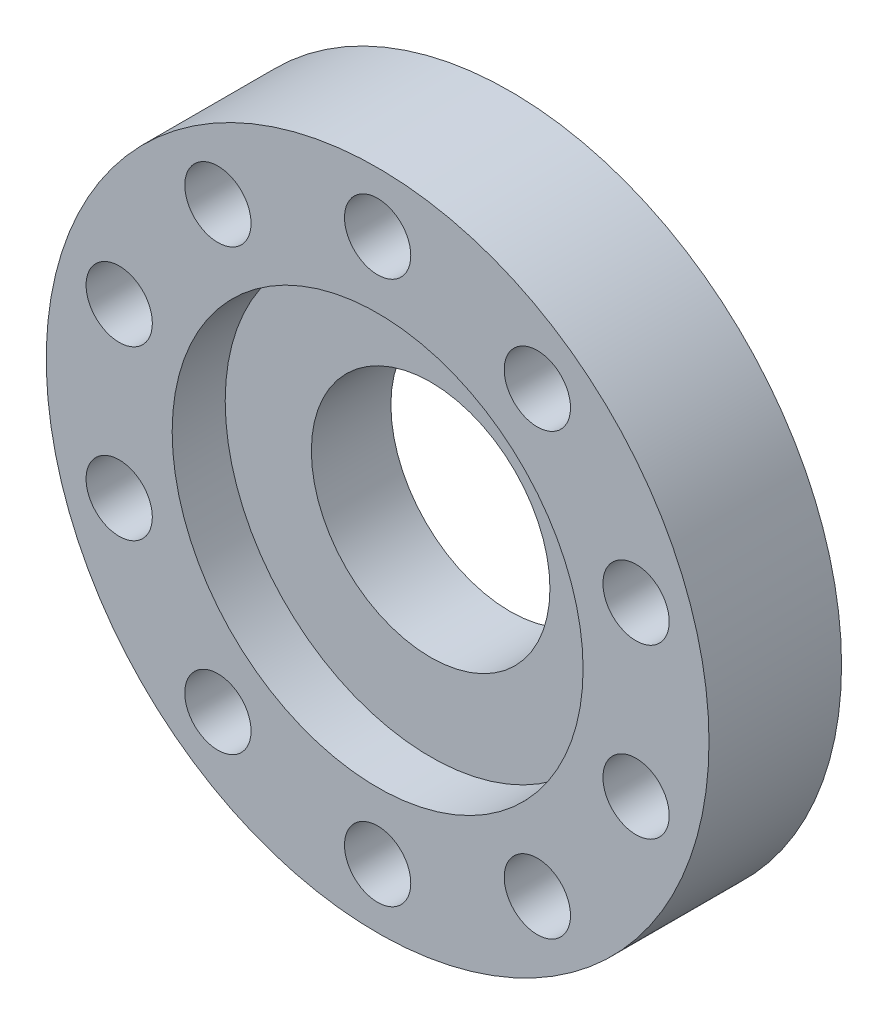
ISO-10303-21;
HEADER;
FILE_DESCRIPTION(('STEP AP214'),'2;1');
FILE_NAME('part.step','',(''),(''),'','','');
FILE_SCHEMA(('AUTOMOTIVE_DESIGN { 1 0 10303 214 1 1 1 1 }'));
ENDSEC;
DATA;
#1=APPLICATION_CONTEXT('core data for automotive mechanical design processes');
#2=APPLICATION_PROTOCOL_DEFINITION('international standard','automotive_design',2000,#1);
#3=PRODUCT_CONTEXT('',#1,'mechanical');
#4=PRODUCT('Part','Part','',(#3));
#5=PRODUCT_RELATED_PRODUCT_CATEGORY('part','',(#4));
#6=PRODUCT_DEFINITION_FORMATION('','',#4);
#7=PRODUCT_DEFINITION_CONTEXT('part definition',#1,'design');
#8=PRODUCT_DEFINITION('design','',#6,#7);
#9=PRODUCT_DEFINITION_SHAPE('','',#8);
#10=(LENGTH_UNIT() NAMED_UNIT(*) SI_UNIT(.MILLI.,.METRE.));
#11=(NAMED_UNIT(*) PLANE_ANGLE_UNIT() SI_UNIT($,.RADIAN.));
#12=(NAMED_UNIT(*) SI_UNIT($,.STERADIAN.) SOLID_ANGLE_UNIT());
#13=UNCERTAINTY_MEASURE_WITH_UNIT(LENGTH_MEASURE(1.E-05),#10,'distance_accuracy_value','');
#14=(GEOMETRIC_REPRESENTATION_CONTEXT(3) GLOBAL_UNCERTAINTY_ASSIGNED_CONTEXT((#13)) GLOBAL_UNIT_ASSIGNED_CONTEXT((#10,
#11,#12)) REPRESENTATION_CONTEXT('',''));
#15=CARTESIAN_POINT('',(0.,0.,0.));
#16=DIRECTION('',(0.,0.,1.));
#17=DIRECTION('',(1.,0.,0.));
#18=AXIS2_PLACEMENT_3D('',#15,#16,#17);
#19=CARTESIAN_POINT('',(0.,0.,20.));
#20=DIRECTION('',(0.,0.,-1.));
#21=DIRECTION('',(-1.,0.,0.));
#22=AXIS2_PLACEMENT_3D('',#19,#20,#21);
#23=CYLINDRICAL_SURFACE('',#22,18.);
#24=CARTESIAN_POINT('',(0.,0.,0.));
#25=DIRECTION('',(0.,0.,1.));
#26=DIRECTION('',(1.,0.,0.));
#27=AXIS2_PLACEMENT_3D('',#24,#25,#26);
#28=CIRCLE('',#27,18.);
#29=CARTESIAN_POINT('',(18.,0.,0.));
#30=VERTEX_POINT('',#29);
#31=EDGE_CURVE('E57',#30,#30,#28,.T.);
#32=ORIENTED_EDGE('',*,*,#31,.F.);
#33=EDGE_LOOP('',(#32));
#34=FACE_BOUND('',#33,.T.);
#35=CARTESIAN_POINT('',(0.,0.,12.));
#36=DIRECTION('',(0.,0.,1.));
#37=DIRECTION('',(1.,0.,0.));
#38=AXIS2_PLACEMENT_3D('',#35,#36,#37);
#39=CIRCLE('',#38,18.);
#40=CARTESIAN_POINT('',(18.,0.,12.));
#41=VERTEX_POINT('',#40);
#42=EDGE_CURVE('E125',#41,#41,#39,.T.);
#43=ORIENTED_EDGE('',*,*,#42,.T.);
#44=EDGE_LOOP('',(#43));
#45=FACE_BOUND('',#44,.T.);
#46=ADVANCED_FACE('F46',(#34,#45),#23,.F.);
#47=CARTESIAN_POINT('',(0.,0.,20.));
#48=DIRECTION('',(0.,0.,1.));
#49=DIRECTION('',(1.,0.,0.));
#50=AXIS2_PLACEMENT_3D('',#47,#48,#49);
#51=PLANE('',#50);
#52=CARTESIAN_POINT('',(0.,0.,20.));
#53=DIRECTION('',(0.,0.,1.));
#54=DIRECTION('',(1.,0.,0.));
#55=AXIS2_PLACEMENT_3D('',#52,#53,#54);
#56=CIRCLE('',#55,31.);
#57=CARTESIAN_POINT('',(31.,0.,20.));
#58=VERTEX_POINT('',#57);
#59=EDGE_CURVE('E122',#58,#58,#56,.T.);
#60=ORIENTED_EDGE('',*,*,#59,.F.);
#61=EDGE_LOOP('',(#60));
#62=FACE_BOUND('',#61,.T.);
#63=CARTESIAN_POINT('',(38.9933171681012,-12.6696967693733,20.));
#64=DIRECTION('',(0.,0.,1.));
#65=DIRECTION('',(1.,0.,0.));
#66=AXIS2_PLACEMENT_3D('',#63,#64,#65);
#67=CIRCLE('',#66,5.);
#68=CARTESIAN_POINT('',(43.9933171681012,-12.6696967693733,20.));
#69=VERTEX_POINT('',#68);
#70=EDGE_CURVE('E107',#69,#69,#67,.T.);
#71=ORIENTED_EDGE('',*,*,#70,.F.);
#72=EDGE_LOOP('',(#71));
#73=FACE_BOUND('',#72,.T.);
#74=CARTESIAN_POINT('',(24.0991953439917,33.1696967693726,20.));
#75=DIRECTION('',(0.,0.,1.));
#76=DIRECTION('',(1.,0.,0.));
#77=AXIS2_PLACEMENT_3D('',#74,#75,#76);
#78=CIRCLE('',#77,5.);
#79=CARTESIAN_POINT('',(29.0991953439917,33.1696967693726,20.));
#80=VERTEX_POINT('',#79);
#81=EDGE_CURVE('E95',#80,#80,#78,.T.);
#82=ORIENTED_EDGE('',*,*,#81,.F.);
#83=EDGE_LOOP('',(#82));
#84=FACE_BOUND('',#83,.T.);
#85=CARTESIAN_POINT('',(-24.0991953439912,33.169696769373,20.));
#86=DIRECTION('',(0.,0.,1.));
#87=DIRECTION('',(1.,0.,0.));
#88=AXIS2_PLACEMENT_3D('',#85,#86,#87);
#89=CIRCLE('',#88,5.);
#90=CARTESIAN_POINT('',(-19.0991953439912,33.169696769373,20.));
#91=VERTEX_POINT('',#90);
#92=EDGE_CURVE('E83',#91,#91,#89,.T.);
#93=ORIENTED_EDGE('',*,*,#92,.F.);
#94=EDGE_LOOP('',(#93));
#95=FACE_BOUND('',#94,.T.);
#96=CARTESIAN_POINT('',(-38.9933171681013,-12.6696967693727,20.));
#97=DIRECTION('',(0.,0.,1.));
#98=DIRECTION('',(1.,0.,0.));
#99=AXIS2_PLACEMENT_3D('',#96,#97,#98);
#100=CIRCLE('',#99,5.);
#101=CARTESIAN_POINT('',(-33.9933171681013,-12.6696967693727,20.));
#102=VERTEX_POINT('',#101);
#103=EDGE_CURVE('E71',#102,#102,#100,.T.);
#104=ORIENTED_EDGE('',*,*,#103,.F.);
#105=EDGE_LOOP('',(#104));
#106=FACE_BOUND('',#105,.T.);
#107=CARTESIAN_POINT('',(0.,-41.,20.));
#108=DIRECTION('',(0.,0.,1.));
#109=DIRECTION('',(1.,0.,0.));
#110=AXIS2_PLACEMENT_3D('',#107,#108,#109);
#111=CIRCLE('',#110,5.);
#112=CARTESIAN_POINT('',(5.,-41.,20.));
#113=VERTEX_POINT('',#112);
#114=EDGE_CURVE('E61',#113,#113,#111,.T.);
#115=ORIENTED_EDGE('',*,*,#114,.F.);
#116=EDGE_LOOP('',(#115));
#117=FACE_BOUND('',#116,.T.);
#118=CARTESIAN_POINT('',(0.,0.,20.));
#119=DIRECTION('',(0.,0.,1.));
#120=DIRECTION('',(1.,0.,0.));
#121=AXIS2_PLACEMENT_3D('',#118,#119,#120);
#122=CIRCLE('',#121,50.);
#123=CARTESIAN_POINT('',(50.,0.,20.));
#124=VERTEX_POINT('',#123);
#125=EDGE_CURVE('E12',#124,#124,#122,.T.);
#126=ORIENTED_EDGE('',*,*,#125,.T.);
#127=EDGE_LOOP('',(#126));
#128=FACE_BOUND('',#127,.T.);
#129=CARTESIAN_POINT('',(-24.0991953439915,-33.1696967693728,20.));
#130=DIRECTION('',(0.,0.,1.));
#131=DIRECTION('',(1.,0.,0.));
#132=AXIS2_PLACEMENT_3D('',#129,#130,#131);
#133=CIRCLE('',#132,5.);
#134=CARTESIAN_POINT('',(-19.0991953439915,-33.1696967693728,20.));
#135=VERTEX_POINT('',#134);
#136=EDGE_CURVE('E65',#135,#135,#133,.T.);
#137=ORIENTED_EDGE('',*,*,#136,.F.);
#138=EDGE_LOOP('',(#137));
#139=FACE_BOUND('',#138,.T.);
#140=CARTESIAN_POINT('',(-38.9933171681012,12.669696769373,20.));
#141=DIRECTION('',(0.,0.,1.));
#142=DIRECTION('',(1.,0.,0.));
#143=AXIS2_PLACEMENT_3D('',#140,#141,#142);
#144=CIRCLE('',#143,5.);
#145=CARTESIAN_POINT('',(-33.9933171681012,12.669696769373,20.));
#146=VERTEX_POINT('',#145);
#147=EDGE_CURVE('E77',#146,#146,#144,.T.);
#148=ORIENTED_EDGE('',*,*,#147,.F.);
#149=EDGE_LOOP('',(#148));
#150=FACE_BOUND('',#149,.T.);
#151=CARTESIAN_POINT('',(2.77555756156289E-13,41.,20.));
#152=DIRECTION('',(0.,0.,1.));
#153=DIRECTION('',(1.,0.,0.));
#154=AXIS2_PLACEMENT_3D('',#151,#152,#153);
#155=CIRCLE('',#154,5.);
#156=CARTESIAN_POINT('',(5.00000000000028,41.,20.));
#157=VERTEX_POINT('',#156);
#158=EDGE_CURVE('E89',#157,#157,#155,.T.);
#159=ORIENTED_EDGE('',*,*,#158,.F.);
#160=EDGE_LOOP('',(#159));
#161=FACE_BOUND('',#160,.T.);
#162=CARTESIAN_POINT('',(38.9933171681014,12.6696967693725,20.));
#163=DIRECTION('',(0.,0.,1.));
#164=DIRECTION('',(1.,0.,0.));
#165=AXIS2_PLACEMENT_3D('',#162,#163,#164);
#166=CIRCLE('',#165,5.);
#167=CARTESIAN_POINT('',(43.9933171681015,12.6696967693725,20.));
#168=VERTEX_POINT('',#167);
#169=EDGE_CURVE('E101',#168,#168,#166,.T.);
#170=ORIENTED_EDGE('',*,*,#169,.F.);
#171=EDGE_LOOP('',(#170));
#172=FACE_BOUND('',#171,.T.);
#173=CARTESIAN_POINT('',(24.099195343991,-33.1696967693732,20.));
#174=DIRECTION('',(0.,0.,1.));
#175=DIRECTION('',(1.,0.,0.));
#176=AXIS2_PLACEMENT_3D('',#173,#174,#175);
#177=CIRCLE('',#176,5.);
#178=CARTESIAN_POINT('',(29.099195343991,-33.1696967693732,20.));
#179=VERTEX_POINT('',#178);
#180=EDGE_CURVE('E113',#179,#179,#177,.T.);
#181=ORIENTED_EDGE('',*,*,#180,.F.);
#182=EDGE_LOOP('',(#181));
#183=FACE_BOUND('',#182,.T.);
#184=ADVANCED_FACE('F145',(#62,#73,#84,#95,#106,#117,#128,#139,#150,#161,#172,#183),#51,.T.);
#185=CARTESIAN_POINT('',(0.,0.,0.));
#186=DIRECTION('',(0.,0.,1.));
#187=DIRECTION('',(1.,0.,0.));
#188=AXIS2_PLACEMENT_3D('',#185,#186,#187);
#189=PLANE('',#188);
#190=CARTESIAN_POINT('',(0.,0.,0.));
#191=DIRECTION('',(0.,0.,1.));
#192=DIRECTION('',(1.,0.,0.));
#193=AXIS2_PLACEMENT_3D('',#190,#191,#192);
#194=CIRCLE('',#193,50.);
#195=CARTESIAN_POINT('',(50.,0.,0.));
#196=VERTEX_POINT('',#195);
#197=EDGE_CURVE('E50',#196,#196,#194,.T.);
#198=ORIENTED_EDGE('',*,*,#197,.F.);
#199=EDGE_LOOP('',(#198));
#200=FACE_BOUND('',#199,.T.);
#201=ORIENTED_EDGE('',*,*,#31,.T.);
#202=EDGE_LOOP('',(#201));
#203=FACE_BOUND('',#202,.T.);
#204=CARTESIAN_POINT('',(0.,-41.,0.));
#205=DIRECTION('',(0.,0.,1.));
#206=DIRECTION('',(1.,0.,0.));
#207=AXIS2_PLACEMENT_3D('',#204,#205,#206);
#208=CIRCLE('',#207,5.);
#209=CARTESIAN_POINT('',(5.,-41.,0.));
#210=VERTEX_POINT('',#209);
#211=EDGE_CURVE('E62',#210,#210,#208,.T.);
#212=ORIENTED_EDGE('',*,*,#211,.T.);
#213=EDGE_LOOP('',(#212));
#214=FACE_BOUND('',#213,.T.);
#215=CARTESIAN_POINT('',(-24.0991953439915,-33.1696967693728,0.));
#216=DIRECTION('',(0.,0.,1.));
#217=DIRECTION('',(1.,0.,0.));
#218=AXIS2_PLACEMENT_3D('',#215,#216,#217);
#219=CIRCLE('',#218,5.);
#220=CARTESIAN_POINT('',(-19.0991953439915,-33.1696967693728,0.));
#221=VERTEX_POINT('',#220);
#222=EDGE_CURVE('E68',#221,#221,#219,.T.);
#223=ORIENTED_EDGE('',*,*,#222,.T.);
#224=EDGE_LOOP('',(#223));
#225=FACE_BOUND('',#224,.T.);
#226=CARTESIAN_POINT('',(-38.9933171681013,-12.6696967693727,0.));
#227=DIRECTION('',(0.,0.,1.));
#228=DIRECTION('',(1.,0.,0.));
#229=AXIS2_PLACEMENT_3D('',#226,#227,#228);
#230=CIRCLE('',#229,5.);
#231=CARTESIAN_POINT('',(-33.9933171681013,-12.6696967693727,0.));
#232=VERTEX_POINT('',#231);
#233=EDGE_CURVE('E74',#232,#232,#230,.T.);
#234=ORIENTED_EDGE('',*,*,#233,.T.);
#235=EDGE_LOOP('',(#234));
#236=FACE_BOUND('',#235,.T.);
#237=CARTESIAN_POINT('',(-38.9933171681012,12.669696769373,0.));
#238=DIRECTION('',(0.,0.,1.));
#239=DIRECTION('',(1.,0.,0.));
#240=AXIS2_PLACEMENT_3D('',#237,#238,#239);
#241=CIRCLE('',#240,5.);
#242=CARTESIAN_POINT('',(-33.9933171681012,12.669696769373,0.));
#243=VERTEX_POINT('',#242);
#244=EDGE_CURVE('E80',#243,#243,#241,.T.);
#245=ORIENTED_EDGE('',*,*,#244,.T.);
#246=EDGE_LOOP('',(#245));
#247=FACE_BOUND('',#246,.T.);
#248=CARTESIAN_POINT('',(-24.0991953439912,33.169696769373,0.));
#249=DIRECTION('',(0.,0.,1.));
#250=DIRECTION('',(1.,0.,0.));
#251=AXIS2_PLACEMENT_3D('',#248,#249,#250);
#252=CIRCLE('',#251,5.);
#253=CARTESIAN_POINT('',(-19.0991953439912,33.169696769373,0.));
#254=VERTEX_POINT('',#253);
#255=EDGE_CURVE('E86',#254,#254,#252,.T.);
#256=ORIENTED_EDGE('',*,*,#255,.T.);
#257=EDGE_LOOP('',(#256));
#258=FACE_BOUND('',#257,.T.);
#259=CARTESIAN_POINT('',(2.77555756156289E-13,41.,0.));
#260=DIRECTION('',(0.,0.,1.));
#261=DIRECTION('',(1.,0.,0.));
#262=AXIS2_PLACEMENT_3D('',#259,#260,#261);
#263=CIRCLE('',#262,5.);
#264=CARTESIAN_POINT('',(5.00000000000028,41.,0.));
#265=VERTEX_POINT('',#264);
#266=EDGE_CURVE('E92',#265,#265,#263,.T.);
#267=ORIENTED_EDGE('',*,*,#266,.T.);
#268=EDGE_LOOP('',(#267));
#269=FACE_BOUND('',#268,.T.);
#270=CARTESIAN_POINT('',(24.0991953439917,33.1696967693726,0.));
#271=DIRECTION('',(0.,0.,1.));
#272=DIRECTION('',(1.,0.,0.));
#273=AXIS2_PLACEMENT_3D('',#270,#271,#272);
#274=CIRCLE('',#273,5.);
#275=CARTESIAN_POINT('',(29.0991953439917,33.1696967693726,0.));
#276=VERTEX_POINT('',#275);
#277=EDGE_CURVE('E98',#276,#276,#274,.T.);
#278=ORIENTED_EDGE('',*,*,#277,.T.);
#279=EDGE_LOOP('',(#278));
#280=FACE_BOUND('',#279,.T.);
#281=CARTESIAN_POINT('',(38.9933171681014,12.6696967693725,0.));
#282=DIRECTION('',(0.,0.,1.));
#283=DIRECTION('',(1.,0.,0.));
#284=AXIS2_PLACEMENT_3D('',#281,#282,#283);
#285=CIRCLE('',#284,5.);
#286=CARTESIAN_POINT('',(43.9933171681015,12.6696967693725,0.));
#287=VERTEX_POINT('',#286);
#288=EDGE_CURVE('E104',#287,#287,#285,.T.);
#289=ORIENTED_EDGE('',*,*,#288,.T.);
#290=EDGE_LOOP('',(#289));
#291=FACE_BOUND('',#290,.T.);
#292=CARTESIAN_POINT('',(38.9933171681012,-12.6696967693733,0.));
#293=DIRECTION('',(0.,0.,1.));
#294=DIRECTION('',(1.,0.,0.));
#295=AXIS2_PLACEMENT_3D('',#292,#293,#294);
#296=CIRCLE('',#295,5.);
#297=CARTESIAN_POINT('',(43.9933171681012,-12.6696967693733,0.));
#298=VERTEX_POINT('',#297);
#299=EDGE_CURVE('E110',#298,#298,#296,.T.);
#300=ORIENTED_EDGE('',*,*,#299,.T.);
#301=EDGE_LOOP('',(#300));
#302=FACE_BOUND('',#301,.T.);
#303=CARTESIAN_POINT('',(24.099195343991,-33.1696967693732,0.));
#304=DIRECTION('',(0.,0.,1.));
#305=DIRECTION('',(1.,0.,0.));
#306=AXIS2_PLACEMENT_3D('',#303,#304,#305);
#307=CIRCLE('',#306,5.);
#308=CARTESIAN_POINT('',(29.099195343991,-33.1696967693732,0.));
#309=VERTEX_POINT('',#308);
#310=EDGE_CURVE('E116',#309,#309,#307,.T.);
#311=ORIENTED_EDGE('',*,*,#310,.T.);
#312=EDGE_LOOP('',(#311));
#313=FACE_BOUND('',#312,.T.);
#314=ADVANCED_FACE('F148',(#200,#203,#214,#225,#236,#247,#258,#269,#280,#291,#302,#313),#189,.F.);
#315=CARTESIAN_POINT('',(0.,0.,20.));
#316=DIRECTION('',(0.,0.,-1.));
#317=DIRECTION('',(-1.,0.,0.));
#318=AXIS2_PLACEMENT_3D('',#315,#316,#317);
#319=CYLINDRICAL_SURFACE('',#318,50.);
#320=ORIENTED_EDGE('',*,*,#125,.F.);
#321=EDGE_LOOP('',(#320));
#322=FACE_BOUND('',#321,.T.);
#323=ORIENTED_EDGE('',*,*,#197,.T.);
#324=EDGE_LOOP('',(#323));
#325=FACE_BOUND('',#324,.T.);
#326=ADVANCED_FACE('F48',(#322,#325),#319,.T.);
#327=CARTESIAN_POINT('',(0.,-41.,20.));
#328=DIRECTION('',(0.,0.,-1.));
#329=DIRECTION('',(-1.,0.,0.));
#330=AXIS2_PLACEMENT_3D('',#327,#328,#329);
#331=CYLINDRICAL_SURFACE('',#330,5.);
#332=ORIENTED_EDGE('',*,*,#114,.T.);
#333=EDGE_LOOP('',(#332));
#334=FACE_BOUND('',#333,.T.);
#335=ORIENTED_EDGE('',*,*,#211,.F.);
#336=EDGE_LOOP('',(#335));
#337=FACE_BOUND('',#336,.T.);
#338=ADVANCED_FACE('F181',(#334,#337),#331,.F.);
#339=CARTESIAN_POINT('',(-24.0991953439915,-33.1696967693728,20.));
#340=DIRECTION('',(0.,0.,-1.));
#341=DIRECTION('',(-1.,0.,0.));
#342=AXIS2_PLACEMENT_3D('',#339,#340,#341);
#343=CYLINDRICAL_SURFACE('',#342,5.);
#344=ORIENTED_EDGE('',*,*,#136,.T.);
#345=EDGE_LOOP('',(#344));
#346=FACE_BOUND('',#345,.T.);
#347=ORIENTED_EDGE('',*,*,#222,.F.);
#348=EDGE_LOOP('',(#347));
#349=FACE_BOUND('',#348,.T.);
#350=ADVANCED_FACE('F194',(#346,#349),#343,.F.);
#351=CARTESIAN_POINT('',(-38.9933171681013,-12.6696967693727,20.));
#352=DIRECTION('',(0.,0.,-1.));
#353=DIRECTION('',(-1.,0.,0.));
#354=AXIS2_PLACEMENT_3D('',#351,#352,#353);
#355=CYLINDRICAL_SURFACE('',#354,5.);
#356=ORIENTED_EDGE('',*,*,#103,.T.);
#357=EDGE_LOOP('',(#356));
#358=FACE_BOUND('',#357,.T.);
#359=ORIENTED_EDGE('',*,*,#233,.F.);
#360=EDGE_LOOP('',(#359));
#361=FACE_BOUND('',#360,.T.);
#362=ADVANCED_FACE('F198',(#358,#361),#355,.F.);
#363=CARTESIAN_POINT('',(-38.9933171681012,12.669696769373,20.));
#364=DIRECTION('',(0.,0.,-1.));
#365=DIRECTION('',(-1.,0.,0.));
#366=AXIS2_PLACEMENT_3D('',#363,#364,#365);
#367=CYLINDRICAL_SURFACE('',#366,5.);
#368=ORIENTED_EDGE('',*,*,#147,.T.);
#369=EDGE_LOOP('',(#368));
#370=FACE_BOUND('',#369,.T.);
#371=ORIENTED_EDGE('',*,*,#244,.F.);
#372=EDGE_LOOP('',(#371));
#373=FACE_BOUND('',#372,.T.);
#374=ADVANCED_FACE('F202',(#370,#373),#367,.F.);
#375=CARTESIAN_POINT('',(-24.0991953439912,33.169696769373,20.));
#376=DIRECTION('',(0.,0.,-1.));
#377=DIRECTION('',(-1.,0.,0.));
#378=AXIS2_PLACEMENT_3D('',#375,#376,#377);
#379=CYLINDRICAL_SURFACE('',#378,5.);
#380=ORIENTED_EDGE('',*,*,#92,.T.);
#381=EDGE_LOOP('',(#380));
#382=FACE_BOUND('',#381,.T.);
#383=ORIENTED_EDGE('',*,*,#255,.F.);
#384=EDGE_LOOP('',(#383));
#385=FACE_BOUND('',#384,.T.);
#386=ADVANCED_FACE('F206',(#382,#385),#379,.F.);
#387=CARTESIAN_POINT('',(2.77555756156289E-13,41.,20.));
#388=DIRECTION('',(0.,0.,-1.));
#389=DIRECTION('',(-1.,0.,0.));
#390=AXIS2_PLACEMENT_3D('',#387,#388,#389);
#391=CYLINDRICAL_SURFACE('',#390,5.);
#392=ORIENTED_EDGE('',*,*,#158,.T.);
#393=EDGE_LOOP('',(#392));
#394=FACE_BOUND('',#393,.T.);
#395=ORIENTED_EDGE('',*,*,#266,.F.);
#396=EDGE_LOOP('',(#395));
#397=FACE_BOUND('',#396,.T.);
#398=ADVANCED_FACE('F210',(#394,#397),#391,.F.);
#399=CARTESIAN_POINT('',(24.0991953439917,33.1696967693726,20.));
#400=DIRECTION('',(0.,0.,-1.));
#401=DIRECTION('',(-1.,0.,0.));
#402=AXIS2_PLACEMENT_3D('',#399,#400,#401);
#403=CYLINDRICAL_SURFACE('',#402,5.);
#404=ORIENTED_EDGE('',*,*,#81,.T.);
#405=EDGE_LOOP('',(#404));
#406=FACE_BOUND('',#405,.T.);
#407=ORIENTED_EDGE('',*,*,#277,.F.);
#408=EDGE_LOOP('',(#407));
#409=FACE_BOUND('',#408,.T.);
#410=ADVANCED_FACE('F214',(#406,#409),#403,.F.);
#411=CARTESIAN_POINT('',(38.9933171681014,12.6696967693725,20.));
#412=DIRECTION('',(0.,0.,-1.));
#413=DIRECTION('',(-1.,0.,0.));
#414=AXIS2_PLACEMENT_3D('',#411,#412,#413);
#415=CYLINDRICAL_SURFACE('',#414,5.);
#416=ORIENTED_EDGE('',*,*,#169,.T.);
#417=EDGE_LOOP('',(#416));
#418=FACE_BOUND('',#417,.T.);
#419=ORIENTED_EDGE('',*,*,#288,.F.);
#420=EDGE_LOOP('',(#419));
#421=FACE_BOUND('',#420,.T.);
#422=ADVANCED_FACE('F218',(#418,#421),#415,.F.);
#423=CARTESIAN_POINT('',(38.9933171681012,-12.6696967693733,20.));
#424=DIRECTION('',(0.,0.,-1.));
#425=DIRECTION('',(-1.,0.,0.));
#426=AXIS2_PLACEMENT_3D('',#423,#424,#425);
#427=CYLINDRICAL_SURFACE('',#426,5.);
#428=ORIENTED_EDGE('',*,*,#70,.T.);
#429=EDGE_LOOP('',(#428));
#430=FACE_BOUND('',#429,.T.);
#431=ORIENTED_EDGE('',*,*,#299,.F.);
#432=EDGE_LOOP('',(#431));
#433=FACE_BOUND('',#432,.T.);
#434=ADVANCED_FACE('F172',(#430,#433),#427,.F.);
#435=CARTESIAN_POINT('',(24.099195343991,-33.1696967693732,20.));
#436=DIRECTION('',(0.,0.,-1.));
#437=DIRECTION('',(-1.,0.,0.));
#438=AXIS2_PLACEMENT_3D('',#435,#436,#437);
#439=CYLINDRICAL_SURFACE('',#438,5.);
#440=ORIENTED_EDGE('',*,*,#180,.T.);
#441=EDGE_LOOP('',(#440));
#442=FACE_BOUND('',#441,.T.);
#443=ORIENTED_EDGE('',*,*,#310,.F.);
#444=EDGE_LOOP('',(#443));
#445=FACE_BOUND('',#444,.T.);
#446=ADVANCED_FACE('F141',(#442,#445),#439,.F.);
#447=CARTESIAN_POINT('',(0.,0.,12.));
#448=DIRECTION('',(0.,0.,1.));
#449=DIRECTION('',(1.,0.,0.));
#450=AXIS2_PLACEMENT_3D('',#447,#448,#449);
#451=CYLINDRICAL_SURFACE('',#450,31.);
#452=CARTESIAN_POINT('',(0.,0.,12.));
#453=DIRECTION('',(0.,0.,1.));
#454=DIRECTION('',(1.,0.,0.));
#455=AXIS2_PLACEMENT_3D('',#452,#453,#454);
#456=CIRCLE('',#455,31.);
#457=CARTESIAN_POINT('',(31.,0.,12.));
#458=VERTEX_POINT('',#457);
#459=EDGE_CURVE('E119',#458,#458,#456,.T.);
#460=ORIENTED_EDGE('',*,*,#459,.F.);
#461=EDGE_LOOP('',(#460));
#462=FACE_BOUND('',#461,.T.);
#463=ORIENTED_EDGE('',*,*,#59,.T.);
#464=EDGE_LOOP('',(#463));
#465=FACE_BOUND('',#464,.T.);
#466=ADVANCED_FACE('F135',(#462,#465),#451,.F.);
#467=CARTESIAN_POINT('',(0.,0.,12.));
#468=DIRECTION('',(0.,0.,1.));
#469=DIRECTION('',(1.,0.,0.));
#470=AXIS2_PLACEMENT_3D('',#467,#468,#469);
#471=PLANE('',#470);
#472=ORIENTED_EDGE('',*,*,#42,.F.);
#473=EDGE_LOOP('',(#472));
#474=FACE_BOUND('',#473,.T.);
#475=ORIENTED_EDGE('',*,*,#459,.T.);
#476=EDGE_LOOP('',(#475));
#477=FACE_BOUND('',#476,.T.);
#478=ADVANCED_FACE('F132',(#474,#477),#471,.T.);
#479=CLOSED_SHELL('',(#46,#184,#314,#326,#338,#350,#362,#374,#386,#398,#410,#422,#434,#446,#466,#478));
#480=MANIFOLD_SOLID_BREP('B2',#479);
#481=ADVANCED_BREP_SHAPE_REPRESENTATION('',(#18,#480),#14);
#482=SHAPE_DEFINITION_REPRESENTATION(#9,#481);
ENDSEC;
END-ISO-10303-21;
